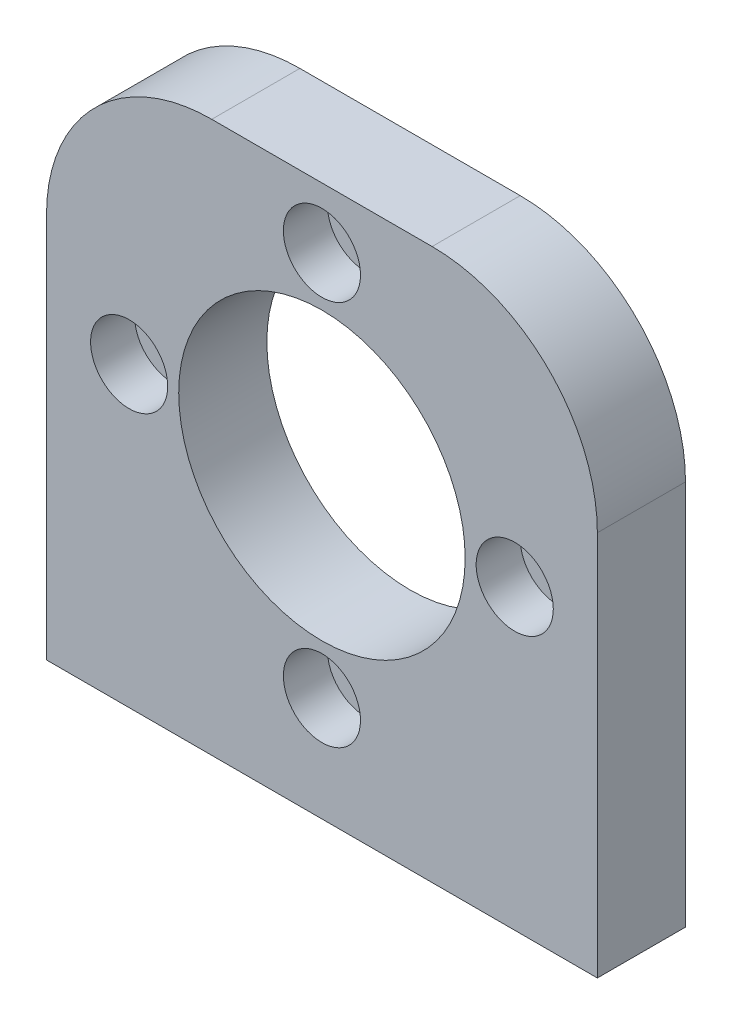
ISO-10303-21;
HEADER;
FILE_DESCRIPTION(('STEP AP214'),'2;1');
FILE_NAME('part.step','',(''),(''),'','','');
FILE_SCHEMA(('AUTOMOTIVE_DESIGN { 1 0 10303 214 1 1 1 1 }'));
ENDSEC;
DATA;
#1=APPLICATION_CONTEXT('core data for automotive mechanical design processes');
#2=APPLICATION_PROTOCOL_DEFINITION('international standard','automotive_design',2000,#1);
#3=PRODUCT_CONTEXT('',#1,'mechanical');
#4=PRODUCT('Part','Part','',(#3));
#5=PRODUCT_RELATED_PRODUCT_CATEGORY('part','',(#4));
#6=PRODUCT_DEFINITION_FORMATION('','',#4);
#7=PRODUCT_DEFINITION_CONTEXT('part definition',#1,'design');
#8=PRODUCT_DEFINITION('design','',#6,#7);
#9=PRODUCT_DEFINITION_SHAPE('','',#8);
#10=(LENGTH_UNIT() NAMED_UNIT(*) SI_UNIT(.MILLI.,.METRE.));
#11=(NAMED_UNIT(*) PLANE_ANGLE_UNIT() SI_UNIT($,.RADIAN.));
#12=(NAMED_UNIT(*) SI_UNIT($,.STERADIAN.) SOLID_ANGLE_UNIT());
#13=UNCERTAINTY_MEASURE_WITH_UNIT(LENGTH_MEASURE(1.E-05),#10,'distance_accuracy_value','');
#14=(GEOMETRIC_REPRESENTATION_CONTEXT(3) GLOBAL_UNCERTAINTY_ASSIGNED_CONTEXT((#13)) GLOBAL_UNIT_ASSIGNED_CONTEXT((#10,
#11,#12)) REPRESENTATION_CONTEXT('',''));
#15=CARTESIAN_POINT('',(0.,0.,0.));
#16=DIRECTION('',(0.,0.,1.));
#17=DIRECTION('',(1.,0.,0.));
#18=AXIS2_PLACEMENT_3D('',#15,#16,#17);
#19=CARTESIAN_POINT('',(64.0625721374263,53.8264858263591,0.));
#20=DIRECTION('',(0.,1.,0.));
#21=DIRECTION('',(0.,0.,1.));
#22=AXIS2_PLACEMENT_3D('',#19,#20,#21);
#23=PLANE('',#22);
#24=DIRECTION('',(-1.,0.,0.));
#25=VECTOR('',#24,1.);
#26=CARTESIAN_POINT('',(64.0625721374263,53.8264858263591,8.));
#27=LINE('',#26,#25);
#28=CARTESIAN_POINT('',(49.0625721374263,53.8264858263591,8.));
#29=VERTEX_POINT('',#28);
#30=CARTESIAN_POINT('',(29.0625721374261,53.8264858263591,8.));
#31=VERTEX_POINT('',#30);
#32=EDGE_CURVE('E166',#29,#31,#27,.T.);
#33=ORIENTED_EDGE('',*,*,#32,.F.);
#34=DIRECTION('',(0.,0.,1.));
#35=VECTOR('',#34,1.);
#36=CARTESIAN_POINT('',(49.0625721374263,53.8264858263591,0.));
#37=LINE('',#36,#35);
#38=CARTESIAN_POINT('',(49.0625721374263,53.8264858263591,0.));
#39=VERTEX_POINT('',#38);
#40=EDGE_CURVE('E202',#29,#39,#37,.F.);
#41=ORIENTED_EDGE('',*,*,#40,.T.);
#42=DIRECTION('',(-1.,0.,0.));
#43=VECTOR('',#42,1.);
#44=CARTESIAN_POINT('',(64.0625721374263,53.8264858263591,0.));
#45=LINE('',#44,#43);
#46=CARTESIAN_POINT('',(29.0625721374261,53.8264858263591,0.));
#47=VERTEX_POINT('',#46);
#48=EDGE_CURVE('E167',#39,#47,#45,.T.);
#49=ORIENTED_EDGE('',*,*,#48,.T.);
#50=DIRECTION('',(0.,0.,1.));
#51=VECTOR('',#50,1.);
#52=CARTESIAN_POINT('',(29.0625721374261,53.8264858263591,0.));
#53=LINE('',#52,#51);
#54=EDGE_CURVE('E199',#47,#31,#53,.T.);
#55=ORIENTED_EDGE('',*,*,#54,.T.);
#56=EDGE_LOOP('',(#33,#41,#49,#55));
#57=FACE_BOUND('',#56,.T.);
#58=ADVANCED_FACE('F34',(#57),#23,.T.);
#59=CARTESIAN_POINT('',(64.0625721374263,3.82648582635881,0.));
#60=DIRECTION('',(1.,0.,0.));
#61=DIRECTION('',(0.,0.,-1.));
#62=AXIS2_PLACEMENT_3D('',#59,#60,#61);
#63=PLANE('',#62);
#64=DIRECTION('',(0.,1.,0.));
#65=VECTOR('',#64,1.);
#66=CARTESIAN_POINT('',(64.0625721374263,3.82648582635881,0.));
#67=LINE('',#66,#65);
#68=CARTESIAN_POINT('',(64.0625721374263,3.82648582635881,0.));
#69=VERTEX_POINT('',#68);
#70=CARTESIAN_POINT('',(64.0625721374263,38.8264858263591,0.));
#71=VERTEX_POINT('',#70);
#72=EDGE_CURVE('E175',#69,#71,#67,.T.);
#73=ORIENTED_EDGE('',*,*,#72,.T.);
#74=DIRECTION('',(0.,0.,1.));
#75=VECTOR('',#74,1.);
#76=CARTESIAN_POINT('',(64.0625721374263,38.8264858263591,0.));
#77=LINE('',#76,#75);
#78=CARTESIAN_POINT('',(64.0625721374263,38.8264858263591,8.));
#79=VERTEX_POINT('',#78);
#80=EDGE_CURVE('E190',#71,#79,#77,.T.);
#81=ORIENTED_EDGE('',*,*,#80,.T.);
#82=DIRECTION('',(0.,1.,0.));
#83=VECTOR('',#82,1.);
#84=CARTESIAN_POINT('',(64.0625721374263,3.82648582635881,8.));
#85=LINE('',#84,#83);
#86=CARTESIAN_POINT('',(64.0625721374263,3.82648582635881,8.));
#87=VERTEX_POINT('',#86);
#88=EDGE_CURVE('E170',#87,#79,#85,.T.);
#89=ORIENTED_EDGE('',*,*,#88,.F.);
#90=DIRECTION('',(0.,0.,1.));
#91=VECTOR('',#90,1.);
#92=CARTESIAN_POINT('',(64.0625721374263,3.82648582635881,0.));
#93=LINE('',#92,#91);
#94=EDGE_CURVE('E188',#69,#87,#93,.T.);
#95=ORIENTED_EDGE('',*,*,#94,.F.);
#96=EDGE_LOOP('',(#73,#81,#89,#95));
#97=FACE_BOUND('',#96,.T.);
#98=ADVANCED_FACE('F212',(#97),#63,.T.);
#99=CARTESIAN_POINT('',(14.0625721374261,3.82648582635881,0.));
#100=DIRECTION('',(0.,-1.,0.));
#101=DIRECTION('',(0.,0.,-1.));
#102=AXIS2_PLACEMENT_3D('',#99,#100,#101);
#103=PLANE('',#102);
#104=CARTESIAN_POINT('',(24.0625721374261,3.8264858263588,4.));
#105=DIRECTION('',(0.,-1.,0.));
#106=DIRECTION('',(0.,0.,-1.));
#107=AXIS2_PLACEMENT_3D('',#104,#105,#106);
#108=CIRCLE('',#107,2.09999999999998);
#109=CARTESIAN_POINT('',(24.0625721374261,3.8264858263588,1.90000000000002));
#110=VERTEX_POINT('',#109);
#111=EDGE_CURVE('E102',#110,#110,#108,.T.);
#112=ORIENTED_EDGE('',*,*,#111,.F.);
#113=EDGE_LOOP('',(#112));
#114=FACE_BOUND('',#113,.T.);
#115=CARTESIAN_POINT('',(54.0625721374263,3.8264858263588,4.));
#116=DIRECTION('',(0.,-1.,0.));
#117=DIRECTION('',(0.,0.,-1.));
#118=AXIS2_PLACEMENT_3D('',#115,#116,#117);
#119=CIRCLE('',#118,2.09999999999998);
#120=CARTESIAN_POINT('',(54.0625721374263,3.8264858263588,1.90000000000002));
#121=VERTEX_POINT('',#120);
#122=EDGE_CURVE('E101',#121,#121,#119,.T.);
#123=ORIENTED_EDGE('',*,*,#122,.F.);
#124=EDGE_LOOP('',(#123));
#125=FACE_BOUND('',#124,.T.);
#126=DIRECTION('',(1.,0.,0.));
#127=VECTOR('',#126,1.);
#128=CARTESIAN_POINT('',(14.0625721374261,3.82648582635881,8.));
#129=LINE('',#128,#127);
#130=CARTESIAN_POINT('',(14.0625721374261,3.82648582635881,8.));
#131=VERTEX_POINT('',#130);
#132=EDGE_CURVE('E183',#131,#87,#129,.T.);
#133=ORIENTED_EDGE('',*,*,#132,.F.);
#134=DIRECTION('',(0.,0.,1.));
#135=VECTOR('',#134,1.);
#136=CARTESIAN_POINT('',(14.0625721374261,3.82648582635881,0.));
#137=LINE('',#136,#135);
#138=CARTESIAN_POINT('',(14.0625721374261,3.82648582635881,0.));
#139=VERTEX_POINT('',#138);
#140=EDGE_CURVE('E178',#139,#131,#137,.T.);
#141=ORIENTED_EDGE('',*,*,#140,.F.);
#142=DIRECTION('',(1.,0.,0.));
#143=VECTOR('',#142,1.);
#144=CARTESIAN_POINT('',(14.0625721374261,3.82648582635881,0.));
#145=LINE('',#144,#143);
#146=EDGE_CURVE('E172',#139,#69,#145,.T.);
#147=ORIENTED_EDGE('',*,*,#146,.T.);
#148=ORIENTED_EDGE('',*,*,#94,.T.);
#149=EDGE_LOOP('',(#133,#141,#147,#148));
#150=FACE_BOUND('',#149,.T.);
#151=ADVANCED_FACE('F225',(#114,#125,#150),#103,.T.);
#152=CARTESIAN_POINT('',(14.0625721374261,53.8264858263591,0.));
#153=DIRECTION('',(-1.,0.,0.));
#154=DIRECTION('',(0.,0.,1.));
#155=AXIS2_PLACEMENT_3D('',#152,#153,#154);
#156=PLANE('',#155);
#157=DIRECTION('',(0.,-1.,0.));
#158=VECTOR('',#157,1.);
#159=CARTESIAN_POINT('',(14.0625721374261,53.8264858263591,8.));
#160=LINE('',#159,#158);
#161=CARTESIAN_POINT('',(14.0625721374261,38.8264858263591,8.));
#162=VERTEX_POINT('',#161);
#163=EDGE_CURVE('E181',#162,#131,#160,.T.);
#164=ORIENTED_EDGE('',*,*,#163,.F.);
#165=DIRECTION('',(0.,0.,1.));
#166=VECTOR('',#165,1.);
#167=CARTESIAN_POINT('',(14.0625721374261,38.8264858263591,0.));
#168=LINE('',#167,#166);
#169=CARTESIAN_POINT('',(14.0625721374261,38.8264858263591,0.));
#170=VERTEX_POINT('',#169);
#171=EDGE_CURVE('E11',#162,#170,#168,.F.);
#172=ORIENTED_EDGE('',*,*,#171,.T.);
#173=DIRECTION('',(0.,-1.,0.));
#174=VECTOR('',#173,1.);
#175=CARTESIAN_POINT('',(14.0625721374261,53.8264858263591,0.));
#176=LINE('',#175,#174);
#177=EDGE_CURVE('E169',#170,#139,#176,.T.);
#178=ORIENTED_EDGE('',*,*,#177,.T.);
#179=ORIENTED_EDGE('',*,*,#140,.T.);
#180=EDGE_LOOP('',(#164,#172,#178,#179));
#181=FACE_BOUND('',#180,.T.);
#182=ADVANCED_FACE('F221',(#181),#156,.T.);
#183=CARTESIAN_POINT('',(0.,0.,0.));
#184=DIRECTION('',(0.,0.,1.));
#185=DIRECTION('',(1.,0.,0.));
#186=AXIS2_PLACEMENT_3D('',#183,#184,#185);
#187=PLANE('',#186);
#188=CARTESIAN_POINT('',(39.0625721374264,13.3293593230027,0.));
#189=DIRECTION('',(0.,0.,1.));
#190=DIRECTION('',(1.,0.,0.));
#191=AXIS2_PLACEMENT_3D('',#188,#189,#190);
#192=CIRCLE('',#191,2.00000000000001);
#193=CARTESIAN_POINT('',(41.0625721374264,13.3293593230027,0.));
#194=VERTEX_POINT('',#193);
#195=EDGE_CURVE('E121',#194,#194,#192,.T.);
#196=ORIENTED_EDGE('',*,*,#195,.T.);
#197=EDGE_LOOP('',(#196));
#198=FACE_BOUND('',#197,.T.);
#199=CARTESIAN_POINT('',(39.0625721374266,48.3293593230027,0.));
#200=DIRECTION('',(0.,0.,1.));
#201=DIRECTION('',(1.,0.,0.));
#202=AXIS2_PLACEMENT_3D('',#199,#200,#201);
#203=CIRCLE('',#202,2.00000000000001);
#204=CARTESIAN_POINT('',(41.0625721374266,48.3293593230027,0.));
#205=VERTEX_POINT('',#204);
#206=EDGE_CURVE('E133',#205,#205,#203,.T.);
#207=ORIENTED_EDGE('',*,*,#206,.T.);
#208=EDGE_LOOP('',(#207));
#209=FACE_BOUND('',#208,.T.);
#210=CARTESIAN_POINT('',(56.5625721374264,30.8293593230027,0.));
#211=DIRECTION('',(0.,0.,1.));
#212=DIRECTION('',(1.,0.,0.));
#213=AXIS2_PLACEMENT_3D('',#210,#211,#212);
#214=CIRCLE('',#213,2.00000000000001);
#215=CARTESIAN_POINT('',(58.5625721374264,30.8293593230027,0.));
#216=VERTEX_POINT('',#215);
#217=EDGE_CURVE('E145',#216,#216,#214,.T.);
#218=ORIENTED_EDGE('',*,*,#217,.T.);
#219=EDGE_LOOP('',(#218));
#220=FACE_BOUND('',#219,.T.);
#221=CARTESIAN_POINT('',(21.5625721374264,30.8293593230028,0.));
#222=DIRECTION('',(0.,0.,1.));
#223=DIRECTION('',(1.,0.,0.));
#224=AXIS2_PLACEMENT_3D('',#221,#222,#223);
#225=CIRCLE('',#224,2.00000000000001);
#226=CARTESIAN_POINT('',(23.5625721374264,30.8293593230028,0.));
#227=VERTEX_POINT('',#226);
#228=EDGE_CURVE('E157',#227,#227,#225,.T.);
#229=ORIENTED_EDGE('',*,*,#228,.T.);
#230=EDGE_LOOP('',(#229));
#231=FACE_BOUND('',#230,.T.);
#232=CARTESIAN_POINT('',(39.0625721374264,30.8293593230027,0.));
#233=DIRECTION('',(0.,0.,-1.));
#234=DIRECTION('',(-1.,0.,0.));
#235=AXIS2_PLACEMENT_3D('',#232,#233,#234);
#236=CIRCLE('',#235,13.);
#237=CARTESIAN_POINT('',(26.0625721374264,30.8293593230027,0.));
#238=VERTEX_POINT('',#237);
#239=EDGE_CURVE('E160',#238,#238,#236,.T.);
#240=ORIENTED_EDGE('',*,*,#239,.F.);
#241=EDGE_LOOP('',(#240));
#242=FACE_BOUND('',#241,.T.);
#243=ORIENTED_EDGE('',*,*,#48,.F.);
#244=CARTESIAN_POINT('',(49.0625721374263,38.8264858263591,0.));
#245=DIRECTION('',(0.,0.,1.));
#246=DIRECTION('',(1.,0.,0.));
#247=AXIS2_PLACEMENT_3D('',#244,#245,#246);
#248=CIRCLE('',#247,15.);
#249=EDGE_CURVE('E42',#39,#71,#248,.F.);
#250=ORIENTED_EDGE('',*,*,#249,.T.);
#251=ORIENTED_EDGE('',*,*,#72,.F.);
#252=ORIENTED_EDGE('',*,*,#146,.F.);
#253=ORIENTED_EDGE('',*,*,#177,.F.);
#254=CARTESIAN_POINT('',(29.0625721374261,38.8264858263591,0.));
#255=DIRECTION('',(0.,0.,1.));
#256=DIRECTION('',(1.,0.,0.));
#257=AXIS2_PLACEMENT_3D('',#254,#255,#256);
#258=CIRCLE('',#257,15.);
#259=EDGE_CURVE('E54',#170,#47,#258,.F.);
#260=ORIENTED_EDGE('',*,*,#259,.T.);
#261=EDGE_LOOP('',(#243,#250,#251,#252,#253,#260));
#262=FACE_BOUND('',#261,.T.);
#263=ADVANCED_FACE('F206',(#198,#209,#220,#231,#242,#262),#187,.F.);
#264=CARTESIAN_POINT('',(0.,0.,8.));
#265=DIRECTION('',(0.,0.,1.));
#266=DIRECTION('',(1.,0.,0.));
#267=AXIS2_PLACEMENT_3D('',#264,#265,#266);
#268=PLANE('',#267);
#269=CARTESIAN_POINT('',(39.0625721374264,13.3293593230027,8.));
#270=DIRECTION('',(0.,0.,1.));
#271=DIRECTION('',(1.,0.,0.));
#272=AXIS2_PLACEMENT_3D('',#269,#270,#271);
#273=CIRCLE('',#272,3.5);
#274=CARTESIAN_POINT('',(42.5625721374264,13.3293593230027,8.));
#275=VERTEX_POINT('',#274);
#276=EDGE_CURVE('E112',#275,#275,#273,.T.);
#277=ORIENTED_EDGE('',*,*,#276,.F.);
#278=EDGE_LOOP('',(#277));
#279=FACE_BOUND('',#278,.T.);
#280=CARTESIAN_POINT('',(39.0625721374266,48.3293593230027,8.));
#281=DIRECTION('',(0.,0.,1.));
#282=DIRECTION('',(1.,0.,0.));
#283=AXIS2_PLACEMENT_3D('',#280,#281,#282);
#284=CIRCLE('',#283,3.5);
#285=CARTESIAN_POINT('',(42.5625721374266,48.3293593230027,8.));
#286=VERTEX_POINT('',#285);
#287=EDGE_CURVE('E124',#286,#286,#284,.T.);
#288=ORIENTED_EDGE('',*,*,#287,.F.);
#289=EDGE_LOOP('',(#288));
#290=FACE_BOUND('',#289,.T.);
#291=CARTESIAN_POINT('',(56.5625721374264,30.8293593230027,8.));
#292=DIRECTION('',(0.,0.,1.));
#293=DIRECTION('',(1.,0.,0.));
#294=AXIS2_PLACEMENT_3D('',#291,#292,#293);
#295=CIRCLE('',#294,3.5);
#296=CARTESIAN_POINT('',(60.0625721374264,30.8293593230027,8.));
#297=VERTEX_POINT('',#296);
#298=EDGE_CURVE('E136',#297,#297,#295,.T.);
#299=ORIENTED_EDGE('',*,*,#298,.F.);
#300=EDGE_LOOP('',(#299));
#301=FACE_BOUND('',#300,.T.);
#302=CARTESIAN_POINT('',(21.5625721374264,30.8293593230028,8.));
#303=DIRECTION('',(0.,0.,1.));
#304=DIRECTION('',(1.,0.,0.));
#305=AXIS2_PLACEMENT_3D('',#302,#303,#304);
#306=CIRCLE('',#305,3.5);
#307=CARTESIAN_POINT('',(25.0625721374264,30.8293593230028,8.));
#308=VERTEX_POINT('',#307);
#309=EDGE_CURVE('E148',#308,#308,#306,.T.);
#310=ORIENTED_EDGE('',*,*,#309,.F.);
#311=EDGE_LOOP('',(#310));
#312=FACE_BOUND('',#311,.T.);
#313=CARTESIAN_POINT('',(39.0625721374264,30.8293593230027,8.00000000000001));
#314=DIRECTION('',(0.,0.,-1.));
#315=DIRECTION('',(-1.,0.,0.));
#316=AXIS2_PLACEMENT_3D('',#313,#314,#315);
#317=CIRCLE('',#316,13.);
#318=CARTESIAN_POINT('',(26.0625721374264,30.8293593230027,8.00000000000001));
#319=VERTEX_POINT('',#318);
#320=EDGE_CURVE('E163',#319,#319,#317,.T.);
#321=ORIENTED_EDGE('',*,*,#320,.T.);
#322=EDGE_LOOP('',(#321));
#323=FACE_BOUND('',#322,.T.);
#324=ORIENTED_EDGE('',*,*,#88,.T.);
#325=CARTESIAN_POINT('',(49.0625721374263,38.8264858263591,8.));
#326=DIRECTION('',(0.,0.,1.));
#327=DIRECTION('',(1.,0.,0.));
#328=AXIS2_PLACEMENT_3D('',#325,#326,#327);
#329=CIRCLE('',#328,15.);
#330=EDGE_CURVE('E197',#79,#29,#329,.T.);
#331=ORIENTED_EDGE('',*,*,#330,.T.);
#332=ORIENTED_EDGE('',*,*,#32,.T.);
#333=CARTESIAN_POINT('',(29.0625721374261,38.8264858263591,8.));
#334=DIRECTION('',(0.,0.,1.));
#335=DIRECTION('',(1.,0.,0.));
#336=AXIS2_PLACEMENT_3D('',#333,#334,#335);
#337=CIRCLE('',#336,15.);
#338=EDGE_CURVE('E195',#31,#162,#337,.T.);
#339=ORIENTED_EDGE('',*,*,#338,.T.);
#340=ORIENTED_EDGE('',*,*,#163,.T.);
#341=ORIENTED_EDGE('',*,*,#132,.T.);
#342=EDGE_LOOP('',(#324,#331,#332,#339,#340,#341));
#343=FACE_BOUND('',#342,.T.);
#344=ADVANCED_FACE('F217',(#279,#290,#301,#312,#323,#343),#268,.T.);
#345=CARTESIAN_POINT('',(39.0625721374264,30.8293593230027,0.));
#346=DIRECTION('',(0.,0.,-1.));
#347=DIRECTION('',(-1.,0.,0.));
#348=AXIS2_PLACEMENT_3D('',#345,#346,#347);
#349=CYLINDRICAL_SURFACE('',#348,13.);
#350=ORIENTED_EDGE('',*,*,#320,.F.);
#351=EDGE_LOOP('',(#350));
#352=FACE_BOUND('',#351,.T.);
#353=ORIENTED_EDGE('',*,*,#239,.T.);
#354=EDGE_LOOP('',(#353));
#355=FACE_BOUND('',#354,.T.);
#356=ADVANCED_FACE('F305',(#352,#355),#349,.F.);
#357=CARTESIAN_POINT('',(21.5625721374264,30.8293593230028,8.));
#358=DIRECTION('',(0.,0.,1.));
#359=DIRECTION('',(1.,0.,0.));
#360=AXIS2_PLACEMENT_3D('',#357,#358,#359);
#361=CYLINDRICAL_SURFACE('',#360,2.00000000000001);
#362=ORIENTED_EDGE('',*,*,#228,.F.);
#363=EDGE_LOOP('',(#362));
#364=FACE_BOUND('',#363,.T.);
#365=CARTESIAN_POINT('',(21.5625721374264,30.8293593230028,4.));
#366=DIRECTION('',(0.,0.,1.));
#367=DIRECTION('',(1.,0.,0.));
#368=AXIS2_PLACEMENT_3D('',#365,#366,#367);
#369=CIRCLE('',#368,2.00000000000002);
#370=CARTESIAN_POINT('',(23.5625721374265,30.8293593230028,4.));
#371=VERTEX_POINT('',#370);
#372=EDGE_CURVE('E154',#371,#371,#369,.T.);
#373=ORIENTED_EDGE('',*,*,#372,.T.);
#374=EDGE_LOOP('',(#373));
#375=FACE_BOUND('',#374,.T.);
#376=ADVANCED_FACE('F301',(#364,#375),#361,.F.);
#377=CARTESIAN_POINT('',(23.5625721374265,30.8293593230028,4.));
#378=DIRECTION('',(0.,0.,-1.));
#379=DIRECTION('',(-1.,0.,0.));
#380=AXIS2_PLACEMENT_3D('',#377,#378,#379);
#381=PLANE('',#380);
#382=ORIENTED_EDGE('',*,*,#372,.F.);
#383=EDGE_LOOP('',(#382));
#384=FACE_BOUND('',#383,.T.);
#385=CARTESIAN_POINT('',(21.5625721374264,30.8293593230028,4.));
#386=DIRECTION('',(0.,0.,1.));
#387=DIRECTION('',(1.,0.,0.));
#388=AXIS2_PLACEMENT_3D('',#385,#386,#387);
#389=CIRCLE('',#388,3.5);
#390=CARTESIAN_POINT('',(25.0625721374264,30.8293593230028,4.));
#391=VERTEX_POINT('',#390);
#392=EDGE_CURVE('E151',#391,#391,#389,.T.);
#393=ORIENTED_EDGE('',*,*,#392,.T.);
#394=EDGE_LOOP('',(#393));
#395=FACE_BOUND('',#394,.T.);
#396=ADVANCED_FACE('F297',(#384,#395),#381,.F.);
#397=CARTESIAN_POINT('',(21.5625721374264,30.8293593230028,8.));
#398=DIRECTION('',(0.,0.,1.));
#399=DIRECTION('',(1.,0.,0.));
#400=AXIS2_PLACEMENT_3D('',#397,#398,#399);
#401=CYLINDRICAL_SURFACE('',#400,3.5);
#402=ORIENTED_EDGE('',*,*,#392,.F.);
#403=EDGE_LOOP('',(#402));
#404=FACE_BOUND('',#403,.T.);
#405=ORIENTED_EDGE('',*,*,#309,.T.);
#406=EDGE_LOOP('',(#405));
#407=FACE_BOUND('',#406,.T.);
#408=ADVANCED_FACE('F293',(#404,#407),#401,.F.);
#409=CARTESIAN_POINT('',(56.5625721374264,30.8293593230027,8.));
#410=DIRECTION('',(0.,0.,1.));
#411=DIRECTION('',(1.,0.,0.));
#412=AXIS2_PLACEMENT_3D('',#409,#410,#411);
#413=CYLINDRICAL_SURFACE('',#412,2.00000000000001);
#414=ORIENTED_EDGE('',*,*,#217,.F.);
#415=EDGE_LOOP('',(#414));
#416=FACE_BOUND('',#415,.T.);
#417=CARTESIAN_POINT('',(56.5625721374264,30.8293593230027,4.));
#418=DIRECTION('',(0.,0.,1.));
#419=DIRECTION('',(1.,0.,0.));
#420=AXIS2_PLACEMENT_3D('',#417,#418,#419);
#421=CIRCLE('',#420,2.00000000000002);
#422=CARTESIAN_POINT('',(58.5625721374265,30.8293593230027,4.));
#423=VERTEX_POINT('',#422);
#424=EDGE_CURVE('E142',#423,#423,#421,.T.);
#425=ORIENTED_EDGE('',*,*,#424,.T.);
#426=EDGE_LOOP('',(#425));
#427=FACE_BOUND('',#426,.T.);
#428=ADVANCED_FACE('F289',(#416,#427),#413,.F.);
#429=CARTESIAN_POINT('',(58.5625721374265,30.8293593230027,4.));
#430=DIRECTION('',(0.,0.,-1.));
#431=DIRECTION('',(-1.,0.,0.));
#432=AXIS2_PLACEMENT_3D('',#429,#430,#431);
#433=PLANE('',#432);
#434=ORIENTED_EDGE('',*,*,#424,.F.);
#435=EDGE_LOOP('',(#434));
#436=FACE_BOUND('',#435,.T.);
#437=CARTESIAN_POINT('',(56.5625721374264,30.8293593230027,4.));
#438=DIRECTION('',(0.,0.,1.));
#439=DIRECTION('',(1.,0.,0.));
#440=AXIS2_PLACEMENT_3D('',#437,#438,#439);
#441=CIRCLE('',#440,3.5);
#442=CARTESIAN_POINT('',(60.0625721374264,30.8293593230027,4.));
#443=VERTEX_POINT('',#442);
#444=EDGE_CURVE('E139',#443,#443,#441,.T.);
#445=ORIENTED_EDGE('',*,*,#444,.T.);
#446=EDGE_LOOP('',(#445));
#447=FACE_BOUND('',#446,.T.);
#448=ADVANCED_FACE('F285',(#436,#447),#433,.F.);
#449=CARTESIAN_POINT('',(56.5625721374264,30.8293593230027,8.));
#450=DIRECTION('',(0.,0.,1.));
#451=DIRECTION('',(1.,0.,0.));
#452=AXIS2_PLACEMENT_3D('',#449,#450,#451);
#453=CYLINDRICAL_SURFACE('',#452,3.5);
#454=ORIENTED_EDGE('',*,*,#444,.F.);
#455=EDGE_LOOP('',(#454));
#456=FACE_BOUND('',#455,.T.);
#457=ORIENTED_EDGE('',*,*,#298,.T.);
#458=EDGE_LOOP('',(#457));
#459=FACE_BOUND('',#458,.T.);
#460=ADVANCED_FACE('F281',(#456,#459),#453,.F.);
#461=CARTESIAN_POINT('',(39.0625721374266,48.3293593230027,8.));
#462=DIRECTION('',(0.,0.,1.));
#463=DIRECTION('',(1.,0.,0.));
#464=AXIS2_PLACEMENT_3D('',#461,#462,#463);
#465=CYLINDRICAL_SURFACE('',#464,2.00000000000001);
#466=ORIENTED_EDGE('',*,*,#206,.F.);
#467=EDGE_LOOP('',(#466));
#468=FACE_BOUND('',#467,.T.);
#469=CARTESIAN_POINT('',(39.0625721374266,48.3293593230027,4.));
#470=DIRECTION('',(0.,0.,1.));
#471=DIRECTION('',(1.,0.,0.));
#472=AXIS2_PLACEMENT_3D('',#469,#470,#471);
#473=CIRCLE('',#472,2.00000000000002);
#474=CARTESIAN_POINT('',(41.0625721374266,48.3293593230027,4.));
#475=VERTEX_POINT('',#474);
#476=EDGE_CURVE('E130',#475,#475,#473,.T.);
#477=ORIENTED_EDGE('',*,*,#476,.T.);
#478=EDGE_LOOP('',(#477));
#479=FACE_BOUND('',#478,.T.);
#480=ADVANCED_FACE('F277',(#468,#479),#465,.F.);
#481=CARTESIAN_POINT('',(41.0625721374266,48.3293593230027,4.));
#482=DIRECTION('',(0.,0.,-1.));
#483=DIRECTION('',(-1.,0.,0.));
#484=AXIS2_PLACEMENT_3D('',#481,#482,#483);
#485=PLANE('',#484);
#486=ORIENTED_EDGE('',*,*,#476,.F.);
#487=EDGE_LOOP('',(#486));
#488=FACE_BOUND('',#487,.T.);
#489=CARTESIAN_POINT('',(39.0625721374266,48.3293593230027,4.));
#490=DIRECTION('',(0.,0.,1.));
#491=DIRECTION('',(1.,0.,0.));
#492=AXIS2_PLACEMENT_3D('',#489,#490,#491);
#493=CIRCLE('',#492,3.5);
#494=CARTESIAN_POINT('',(42.5625721374266,48.3293593230027,4.));
#495=VERTEX_POINT('',#494);
#496=EDGE_CURVE('E127',#495,#495,#493,.T.);
#497=ORIENTED_EDGE('',*,*,#496,.T.);
#498=EDGE_LOOP('',(#497));
#499=FACE_BOUND('',#498,.T.);
#500=ADVANCED_FACE('F273',(#488,#499),#485,.F.);
#501=CARTESIAN_POINT('',(39.0625721374266,48.3293593230027,8.));
#502=DIRECTION('',(0.,0.,1.));
#503=DIRECTION('',(1.,0.,0.));
#504=AXIS2_PLACEMENT_3D('',#501,#502,#503);
#505=CYLINDRICAL_SURFACE('',#504,3.5);
#506=ORIENTED_EDGE('',*,*,#496,.F.);
#507=EDGE_LOOP('',(#506));
#508=FACE_BOUND('',#507,.T.);
#509=ORIENTED_EDGE('',*,*,#287,.T.);
#510=EDGE_LOOP('',(#509));
#511=FACE_BOUND('',#510,.T.);
#512=ADVANCED_FACE('F269',(#508,#511),#505,.F.);
#513=CARTESIAN_POINT('',(39.0625721374264,13.3293593230027,8.));
#514=DIRECTION('',(0.,0.,1.));
#515=DIRECTION('',(1.,0.,0.));
#516=AXIS2_PLACEMENT_3D('',#513,#514,#515);
#517=CYLINDRICAL_SURFACE('',#516,2.00000000000001);
#518=ORIENTED_EDGE('',*,*,#195,.F.);
#519=EDGE_LOOP('',(#518));
#520=FACE_BOUND('',#519,.T.);
#521=CARTESIAN_POINT('',(39.0625721374264,13.3293593230027,4.));
#522=DIRECTION('',(0.,0.,1.));
#523=DIRECTION('',(1.,0.,0.));
#524=AXIS2_PLACEMENT_3D('',#521,#522,#523);
#525=CIRCLE('',#524,2.00000000000002);
#526=CARTESIAN_POINT('',(41.0625721374264,13.3293593230027,4.));
#527=VERTEX_POINT('',#526);
#528=EDGE_CURVE('E118',#527,#527,#525,.T.);
#529=ORIENTED_EDGE('',*,*,#528,.T.);
#530=EDGE_LOOP('',(#529));
#531=FACE_BOUND('',#530,.T.);
#532=ADVANCED_FACE('F265',(#520,#531),#517,.F.);
#533=CARTESIAN_POINT('',(41.0625721374264,13.3293593230027,4.));
#534=DIRECTION('',(0.,0.,-1.));
#535=DIRECTION('',(-1.,0.,0.));
#536=AXIS2_PLACEMENT_3D('',#533,#534,#535);
#537=PLANE('',#536);
#538=ORIENTED_EDGE('',*,*,#528,.F.);
#539=EDGE_LOOP('',(#538));
#540=FACE_BOUND('',#539,.T.);
#541=CARTESIAN_POINT('',(39.0625721374264,13.3293593230027,4.));
#542=DIRECTION('',(0.,0.,1.));
#543=DIRECTION('',(1.,0.,0.));
#544=AXIS2_PLACEMENT_3D('',#541,#542,#543);
#545=CIRCLE('',#544,3.5);
#546=CARTESIAN_POINT('',(42.5625721374264,13.3293593230027,4.));
#547=VERTEX_POINT('',#546);
#548=EDGE_CURVE('E115',#547,#547,#545,.T.);
#549=ORIENTED_EDGE('',*,*,#548,.T.);
#550=EDGE_LOOP('',(#549));
#551=FACE_BOUND('',#550,.T.);
#552=ADVANCED_FACE('F261',(#540,#551),#537,.F.);
#553=CARTESIAN_POINT('',(39.0625721374264,13.3293593230027,8.));
#554=DIRECTION('',(0.,0.,1.));
#555=DIRECTION('',(1.,0.,0.));
#556=AXIS2_PLACEMENT_3D('',#553,#554,#555);
#557=CYLINDRICAL_SURFACE('',#556,3.5);
#558=ORIENTED_EDGE('',*,*,#548,.F.);
#559=EDGE_LOOP('',(#558));
#560=FACE_BOUND('',#559,.T.);
#561=ORIENTED_EDGE('',*,*,#276,.T.);
#562=EDGE_LOOP('',(#561));
#563=FACE_BOUND('',#562,.T.);
#564=ADVANCED_FACE('F257',(#560,#563),#557,.F.);
#565=CARTESIAN_POINT('',(54.0625721374263,16.2264858263588,4.));
#566=DIRECTION('',(0.,-1.,0.));
#567=DIRECTION('',(0.,0.,-1.));
#568=AXIS2_PLACEMENT_3D('',#565,#566,#567);
#569=CONICAL_SURFACE('',#568,2.09999999999998,1.02974425868655);
#570=CARTESIAN_POINT('',(54.0625721374263,17.4882931262884,4.));
#571=VERTEX_POINT('',#570);
#572=VERTEX_LOOP('',#571);
#573=FACE_BOUND('',#572,.T.);
#574=CARTESIAN_POINT('',(54.0625721374263,16.2264858263588,4.));
#575=DIRECTION('',(0.,-1.,0.));
#576=DIRECTION('',(0.,0.,-1.));
#577=AXIS2_PLACEMENT_3D('',#574,#575,#576);
#578=CIRCLE('',#577,2.09999999999998);
#579=CARTESIAN_POINT('',(54.0625721374263,16.2264858263588,1.90000000000002));
#580=VERTEX_POINT('',#579);
#581=EDGE_CURVE('E105',#580,#580,#578,.T.);
#582=ORIENTED_EDGE('',*,*,#581,.T.);
#583=EDGE_LOOP('',(#582));
#584=FACE_BOUND('',#583,.T.);
#585=ADVANCED_FACE('F253',(#573,#584),#569,.F.);
#586=CARTESIAN_POINT('',(54.0625721374263,3.82648582635881,4.));
#587=DIRECTION('',(0.,-1.,0.));
#588=DIRECTION('',(0.,0.,-1.));
#589=AXIS2_PLACEMENT_3D('',#586,#587,#588);
#590=CYLINDRICAL_SURFACE('',#589,2.09999999999998);
#591=ORIENTED_EDGE('',*,*,#581,.F.);
#592=EDGE_LOOP('',(#591));
#593=FACE_BOUND('',#592,.T.);
#594=ORIENTED_EDGE('',*,*,#122,.T.);
#595=EDGE_LOOP('',(#594));
#596=FACE_BOUND('',#595,.T.);
#597=ADVANCED_FACE('F95',(#593,#596),#590,.F.);
#598=CARTESIAN_POINT('',(24.0625721374261,16.2264858263588,4.));
#599=DIRECTION('',(0.,-1.,0.));
#600=DIRECTION('',(0.,0.,-1.));
#601=AXIS2_PLACEMENT_3D('',#598,#599,#600);
#602=CONICAL_SURFACE('',#601,2.09999999999998,1.02974425868655);
#603=CARTESIAN_POINT('',(24.0625721374261,17.4882931262884,4.));
#604=VERTEX_POINT('',#603);
#605=VERTEX_LOOP('',#604);
#606=FACE_BOUND('',#605,.T.);
#607=CARTESIAN_POINT('',(24.0625721374261,16.2264858263588,4.));
#608=DIRECTION('',(0.,-1.,0.));
#609=DIRECTION('',(0.,0.,-1.));
#610=AXIS2_PLACEMENT_3D('',#607,#608,#609);
#611=CIRCLE('',#610,2.09999999999998);
#612=CARTESIAN_POINT('',(24.0625721374261,16.2264858263588,1.90000000000002));
#613=VERTEX_POINT('',#612);
#614=EDGE_CURVE('E99',#613,#613,#611,.T.);
#615=ORIENTED_EDGE('',*,*,#614,.T.);
#616=EDGE_LOOP('',(#615));
#617=FACE_BOUND('',#616,.T.);
#618=ADVANCED_FACE('F91',(#606,#617),#602,.F.);
#619=CARTESIAN_POINT('',(24.0625721374261,3.82648582635881,4.));
#620=DIRECTION('',(0.,-1.,0.));
#621=DIRECTION('',(0.,0.,-1.));
#622=AXIS2_PLACEMENT_3D('',#619,#620,#621);
#623=CYLINDRICAL_SURFACE('',#622,2.09999999999998);
#624=ORIENTED_EDGE('',*,*,#614,.F.);
#625=EDGE_LOOP('',(#624));
#626=FACE_BOUND('',#625,.T.);
#627=ORIENTED_EDGE('',*,*,#111,.T.);
#628=EDGE_LOOP('',(#627));
#629=FACE_BOUND('',#628,.T.);
#630=ADVANCED_FACE('F94',(#626,#629),#623,.F.);
#631=CARTESIAN_POINT('',(49.0625721374263,38.8264858263591,0.));
#632=DIRECTION('',(0.,0.,1.));
#633=DIRECTION('',(1.,0.,0.));
#634=AXIS2_PLACEMENT_3D('',#631,#632,#633);
#635=CYLINDRICAL_SURFACE('',#634,15.);
#636=ORIENTED_EDGE('',*,*,#249,.F.);
#637=ORIENTED_EDGE('',*,*,#40,.F.);
#638=ORIENTED_EDGE('',*,*,#330,.F.);
#639=ORIENTED_EDGE('',*,*,#80,.F.);
#640=EDGE_LOOP('',(#636,#637,#638,#639));
#641=FACE_BOUND('',#640,.T.);
#642=ADVANCED_FACE('F214',(#641),#635,.T.);
#643=CARTESIAN_POINT('',(29.0625721374261,38.8264858263591,0.));
#644=DIRECTION('',(0.,0.,1.));
#645=DIRECTION('',(1.,0.,0.));
#646=AXIS2_PLACEMENT_3D('',#643,#644,#645);
#647=CYLINDRICAL_SURFACE('',#646,15.);
#648=ORIENTED_EDGE('',*,*,#259,.F.);
#649=ORIENTED_EDGE('',*,*,#171,.F.);
#650=ORIENTED_EDGE('',*,*,#338,.F.);
#651=ORIENTED_EDGE('',*,*,#54,.F.);
#652=EDGE_LOOP('',(#648,#649,#650,#651));
#653=FACE_BOUND('',#652,.T.);
#654=ADVANCED_FACE('F36',(#653),#647,.T.);
#655=CLOSED_SHELL('',(#58,#98,#151,#182,#263,#344,#356,#376,#396,#408,#428,#448,#460,#480,#500,
#512,#532,#552,#564,#585,#597,#618,#630,#642,#654));
#656=MANIFOLD_SOLID_BREP('B2',#655);
#657=ADVANCED_BREP_SHAPE_REPRESENTATION('',(#18,#656),#14);
#658=SHAPE_DEFINITION_REPRESENTATION(#9,#657);
ENDSEC;
END-ISO-10303-21;
